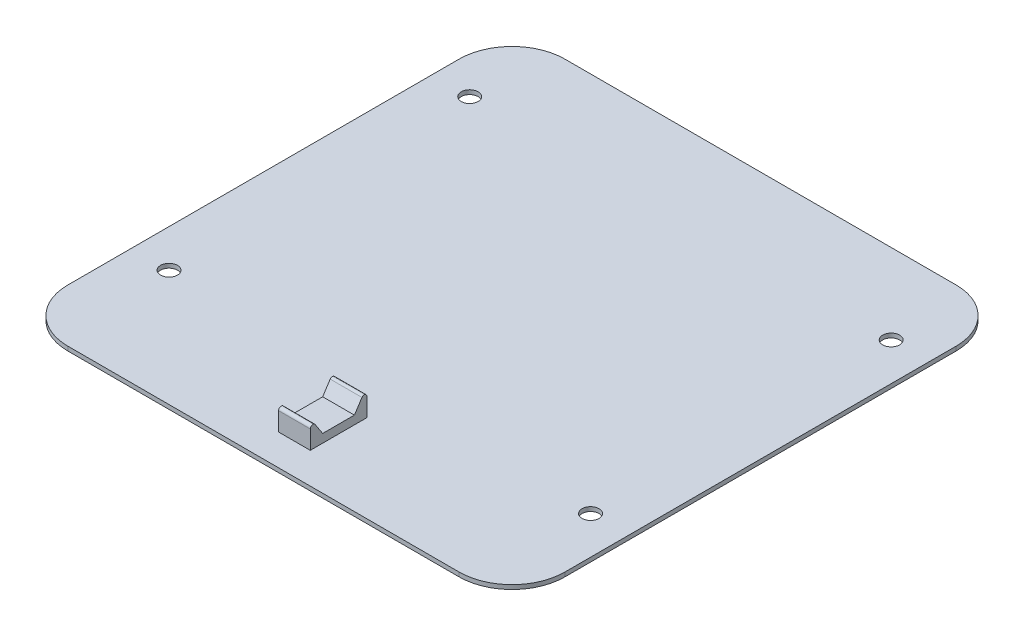
ISO-10303-21;
HEADER;
FILE_DESCRIPTION(('STEP AP214'),'2;1');
FILE_NAME('part.step','',(''),(''),'','','');
FILE_SCHEMA(('AUTOMOTIVE_DESIGN { 1 0 10303 214 1 1 1 1 }'));
ENDSEC;
DATA;
#1=APPLICATION_CONTEXT('core data for automotive mechanical design processes');
#2=APPLICATION_PROTOCOL_DEFINITION('international standard','automotive_design',2000,#1);
#3=PRODUCT_CONTEXT('',#1,'mechanical');
#4=PRODUCT('Part','Part','',(#3));
#5=PRODUCT_RELATED_PRODUCT_CATEGORY('part','',(#4));
#6=PRODUCT_DEFINITION_FORMATION('','',#4);
#7=PRODUCT_DEFINITION_CONTEXT('part definition',#1,'design');
#8=PRODUCT_DEFINITION('design','',#6,#7);
#9=PRODUCT_DEFINITION_SHAPE('','',#8);
#10=(LENGTH_UNIT() NAMED_UNIT(*) SI_UNIT(.MILLI.,.METRE.));
#11=(NAMED_UNIT(*) PLANE_ANGLE_UNIT() SI_UNIT($,.RADIAN.));
#12=(NAMED_UNIT(*) SI_UNIT($,.STERADIAN.) SOLID_ANGLE_UNIT());
#13=UNCERTAINTY_MEASURE_WITH_UNIT(LENGTH_MEASURE(1.E-05),#10,'distance_accuracy_value','');
#14=(GEOMETRIC_REPRESENTATION_CONTEXT(3) GLOBAL_UNCERTAINTY_ASSIGNED_CONTEXT((#13)) GLOBAL_UNIT_ASSIGNED_CONTEXT((#10,
#11,#12)) REPRESENTATION_CONTEXT('',''));
#15=CARTESIAN_POINT('',(0.,0.,0.));
#16=DIRECTION('',(0.,0.,1.));
#17=DIRECTION('',(1.,0.,0.));
#18=AXIS2_PLACEMENT_3D('',#15,#16,#17);
#19=CARTESIAN_POINT('',(47.,0.8,-47.));
#20=DIRECTION('',(-1.,0.,0.));
#21=DIRECTION('',(0.,0.,1.));
#22=AXIS2_PLACEMENT_3D('',#19,#20,#21);
#23=PLANE('',#22);
#24=DIRECTION('',(0.,0.,-1.));
#25=VECTOR('',#24,1.);
#26=CARTESIAN_POINT('',(47.,0.,-47.));
#27=LINE('',#26,#25);
#28=CARTESIAN_POINT('',(47.,0.,37.));
#29=VERTEX_POINT('',#28);
#30=CARTESIAN_POINT('',(47.,0.,-37.));
#31=VERTEX_POINT('',#30);
#32=EDGE_CURVE('E223',#29,#31,#27,.T.);
#33=ORIENTED_EDGE('',*,*,#32,.T.);
#34=DIRECTION('',(0.,-1.,0.));
#35=VECTOR('',#34,1.);
#36=CARTESIAN_POINT('',(47.,0.8,-37.));
#37=LINE('',#36,#35);
#38=CARTESIAN_POINT('',(47.,0.8,-37.));
#39=VERTEX_POINT('',#38);
#40=EDGE_CURVE('E263',#31,#39,#37,.F.);
#41=ORIENTED_EDGE('',*,*,#40,.T.);
#42=DIRECTION('',(0.,0.,-1.));
#43=VECTOR('',#42,1.);
#44=CARTESIAN_POINT('',(47.,0.8,-47.));
#45=LINE('',#44,#43);
#46=CARTESIAN_POINT('',(47.,0.8,37.));
#47=VERTEX_POINT('',#46);
#48=EDGE_CURVE('E224',#47,#39,#45,.T.);
#49=ORIENTED_EDGE('',*,*,#48,.F.);
#50=DIRECTION('',(0.,-1.,0.));
#51=VECTOR('',#50,1.);
#52=CARTESIAN_POINT('',(47.,0.8,37.));
#53=LINE('',#52,#51);
#54=EDGE_CURVE('E260',#47,#29,#53,.T.);
#55=ORIENTED_EDGE('',*,*,#54,.T.);
#56=EDGE_LOOP('',(#33,#41,#49,#55));
#57=FACE_BOUND('',#56,.T.);
#58=ADVANCED_FACE('F35',(#57),#23,.F.);
#59=CARTESIAN_POINT('',(-47.,0.8,-47.));
#60=DIRECTION('',(0.,0.,1.));
#61=DIRECTION('',(1.,0.,0.));
#62=AXIS2_PLACEMENT_3D('',#59,#60,#61);
#63=PLANE('',#62);
#64=DIRECTION('',(-1.,0.,0.));
#65=VECTOR('',#64,1.);
#66=CARTESIAN_POINT('',(-47.,0.8,-47.));
#67=LINE('',#66,#65);
#68=CARTESIAN_POINT('',(37.,0.8,-47.));
#69=VERTEX_POINT('',#68);
#70=CARTESIAN_POINT('',(-37.,0.8,-47.));
#71=VERTEX_POINT('',#70);
#72=EDGE_CURVE('E227',#69,#71,#67,.T.);
#73=ORIENTED_EDGE('',*,*,#72,.F.);
#74=DIRECTION('',(0.,-1.,0.));
#75=VECTOR('',#74,1.);
#76=CARTESIAN_POINT('',(37.,0.8,-47.));
#77=LINE('',#76,#75);
#78=CARTESIAN_POINT('',(37.,0.,-47.));
#79=VERTEX_POINT('',#78);
#80=EDGE_CURVE('E249',#69,#79,#77,.T.);
#81=ORIENTED_EDGE('',*,*,#80,.T.);
#82=DIRECTION('',(-1.,0.,0.));
#83=VECTOR('',#82,1.);
#84=CARTESIAN_POINT('',(-47.,0.,-47.));
#85=LINE('',#84,#83);
#86=CARTESIAN_POINT('',(-37.,0.,-47.));
#87=VERTEX_POINT('',#86);
#88=EDGE_CURVE('E240',#79,#87,#85,.T.);
#89=ORIENTED_EDGE('',*,*,#88,.T.);
#90=DIRECTION('',(0.,-1.,0.));
#91=VECTOR('',#90,1.);
#92=CARTESIAN_POINT('',(-37.,0.8,-47.));
#93=LINE('',#92,#91);
#94=EDGE_CURVE('E237',#87,#71,#93,.F.);
#95=ORIENTED_EDGE('',*,*,#94,.T.);
#96=EDGE_LOOP('',(#73,#81,#89,#95));
#97=FACE_BOUND('',#96,.T.);
#98=ADVANCED_FACE('F321',(#97),#63,.F.);
#99=CARTESIAN_POINT('',(-47.,0.8,-47.));
#100=DIRECTION('',(1.,0.,0.));
#101=DIRECTION('',(0.,0.,-1.));
#102=AXIS2_PLACEMENT_3D('',#99,#100,#101);
#103=PLANE('',#102);
#104=DIRECTION('',(0.,0.,1.));
#105=VECTOR('',#104,1.);
#106=CARTESIAN_POINT('',(-47.,0.,-47.));
#107=LINE('',#106,#105);
#108=CARTESIAN_POINT('',(-47.,0.,-37.));
#109=VERTEX_POINT('',#108);
#110=CARTESIAN_POINT('',(-47.,0.,37.));
#111=VERTEX_POINT('',#110);
#112=EDGE_CURVE('E243',#109,#111,#107,.T.);
#113=ORIENTED_EDGE('',*,*,#112,.T.);
#114=DIRECTION('',(0.,-1.,0.));
#115=VECTOR('',#114,1.);
#116=CARTESIAN_POINT('',(-47.,0.8,37.));
#117=LINE('',#116,#115);
#118=CARTESIAN_POINT('',(-47.,0.8,37.));
#119=VERTEX_POINT('',#118);
#120=EDGE_CURVE('E281',#111,#119,#117,.F.);
#121=ORIENTED_EDGE('',*,*,#120,.T.);
#122=DIRECTION('',(0.,0.,1.));
#123=VECTOR('',#122,1.);
#124=CARTESIAN_POINT('',(-47.,0.8,-47.));
#125=LINE('',#124,#123);
#126=CARTESIAN_POINT('',(-47.,0.8,-37.));
#127=VERTEX_POINT('',#126);
#128=EDGE_CURVE('E231',#127,#119,#125,.T.);
#129=ORIENTED_EDGE('',*,*,#128,.F.);
#130=DIRECTION('',(0.,-1.,0.));
#131=VECTOR('',#130,1.);
#132=CARTESIAN_POINT('',(-47.,0.8,-37.));
#133=LINE('',#132,#131);
#134=EDGE_CURVE('E278',#127,#109,#133,.T.);
#135=ORIENTED_EDGE('',*,*,#134,.T.);
#136=EDGE_LOOP('',(#113,#121,#129,#135));
#137=FACE_BOUND('',#136,.T.);
#138=ADVANCED_FACE('F327',(#137),#103,.F.);
#139=CARTESIAN_POINT('',(-47.,0.8,47.));
#140=DIRECTION('',(0.,0.,-1.));
#141=DIRECTION('',(-1.,0.,0.));
#142=AXIS2_PLACEMENT_3D('',#139,#140,#141);
#143=PLANE('',#142);
#144=DIRECTION('',(1.,0.,0.));
#145=VECTOR('',#144,1.);
#146=CARTESIAN_POINT('',(-47.,0.,47.));
#147=LINE('',#146,#145);
#148=CARTESIAN_POINT('',(-37.,0.,47.));
#149=VERTEX_POINT('',#148);
#150=CARTESIAN_POINT('',(37.,0.,47.));
#151=VERTEX_POINT('',#150);
#152=EDGE_CURVE('E228',#149,#151,#147,.T.);
#153=ORIENTED_EDGE('',*,*,#152,.T.);
#154=DIRECTION('',(0.,-1.,0.));
#155=VECTOR('',#154,1.);
#156=CARTESIAN_POINT('',(37.,0.8,47.));
#157=LINE('',#156,#155);
#158=CARTESIAN_POINT('',(37.,0.8,47.));
#159=VERTEX_POINT('',#158);
#160=EDGE_CURVE('E276',#151,#159,#157,.F.);
#161=ORIENTED_EDGE('',*,*,#160,.T.);
#162=DIRECTION('',(1.,0.,0.));
#163=VECTOR('',#162,1.);
#164=CARTESIAN_POINT('',(-47.,0.8,47.));
#165=LINE('',#164,#163);
#166=CARTESIAN_POINT('',(-37.,0.8,47.));
#167=VERTEX_POINT('',#166);
#168=EDGE_CURVE('E234',#167,#159,#165,.T.);
#169=ORIENTED_EDGE('',*,*,#168,.F.);
#170=DIRECTION('',(0.,-1.,0.));
#171=VECTOR('',#170,1.);
#172=CARTESIAN_POINT('',(-37.,0.8,47.));
#173=LINE('',#172,#171);
#174=EDGE_CURVE('E273',#167,#149,#173,.T.);
#175=ORIENTED_EDGE('',*,*,#174,.T.);
#176=EDGE_LOOP('',(#153,#161,#169,#175));
#177=FACE_BOUND('',#176,.T.);
#178=ADVANCED_FACE('F369',(#177),#143,.F.);
#179=CARTESIAN_POINT('',(0.,0.8,0.));
#180=DIRECTION('',(0.,1.,0.));
#181=DIRECTION('',(0.,0.,1.));
#182=AXIS2_PLACEMENT_3D('',#179,#180,#181);
#183=PLANE('',#182);
#184=DIRECTION('',(0.,0.,-1.));
#185=VECTOR('',#184,1.);
#186=CARTESIAN_POINT('',(3.,0.8,41.145));
#187=LINE('',#186,#185);
#188=CARTESIAN_POINT('',(3.,0.8,41.145));
#189=VERTEX_POINT('',#188);
#190=CARTESIAN_POINT('',(3.,0.8,30.455));
#191=VERTEX_POINT('',#190);
#192=EDGE_CURVE('E150',#189,#191,#187,.T.);
#193=ORIENTED_EDGE('',*,*,#192,.F.);
#194=DIRECTION('',(-1.,0.,0.));
#195=VECTOR('',#194,1.);
#196=CARTESIAN_POINT('',(3.,0.8,41.145));
#197=LINE('',#196,#195);
#198=CARTESIAN_POINT('',(-3.,0.8,41.145));
#199=VERTEX_POINT('',#198);
#200=EDGE_CURVE('E158',#189,#199,#197,.T.);
#201=ORIENTED_EDGE('',*,*,#200,.T.);
#202=DIRECTION('',(0.,0.,-1.));
#203=VECTOR('',#202,1.);
#204=CARTESIAN_POINT('',(-3.,0.8,41.145));
#205=LINE('',#204,#203);
#206=CARTESIAN_POINT('',(-3.,0.8,30.455));
#207=VERTEX_POINT('',#206);
#208=EDGE_CURVE('E184',#199,#207,#205,.T.);
#209=ORIENTED_EDGE('',*,*,#208,.T.);
#210=DIRECTION('',(-1.,0.,0.));
#211=VECTOR('',#210,1.);
#212=CARTESIAN_POINT('',(3.,0.8,30.455));
#213=LINE('',#212,#211);
#214=EDGE_CURVE('E166',#191,#207,#213,.T.);
#215=ORIENTED_EDGE('',*,*,#214,.F.);
#216=EDGE_LOOP('',(#193,#201,#209,#215));
#217=FACE_BOUND('',#216,.T.);
#218=CARTESIAN_POINT('',(-39.85,0.8,25.));
#219=DIRECTION('',(0.,1.,0.));
#220=DIRECTION('',(0.,0.,1.));
#221=AXIS2_PLACEMENT_3D('',#218,#219,#220);
#222=CIRCLE('',#221,1.6);
#223=CARTESIAN_POINT('',(-39.85,0.8,26.6));
#224=VERTEX_POINT('',#223);
#225=EDGE_CURVE('E165',#224,#224,#222,.T.);
#226=ORIENTED_EDGE('',*,*,#225,.F.);
#227=EDGE_LOOP('',(#226));
#228=FACE_BOUND('',#227,.T.);
#229=CARTESIAN_POINT('',(39.85,0.8,25.));
#230=DIRECTION('',(0.,1.,0.));
#231=DIRECTION('',(0.,0.,1.));
#232=AXIS2_PLACEMENT_3D('',#229,#230,#231);
#233=CIRCLE('',#232,1.6);
#234=CARTESIAN_POINT('',(39.85,0.8,26.6));
#235=VERTEX_POINT('',#234);
#236=EDGE_CURVE('E208',#235,#235,#233,.T.);
#237=ORIENTED_EDGE('',*,*,#236,.F.);
#238=EDGE_LOOP('',(#237));
#239=FACE_BOUND('',#238,.T.);
#240=CARTESIAN_POINT('',(39.85,0.8,-31.85));
#241=DIRECTION('',(0.,1.,0.));
#242=DIRECTION('',(0.,0.,1.));
#243=AXIS2_PLACEMENT_3D('',#240,#241,#242);
#244=CIRCLE('',#243,1.6);
#245=CARTESIAN_POINT('',(39.85,0.8,-30.25));
#246=VERTEX_POINT('',#245);
#247=EDGE_CURVE('E200',#246,#246,#244,.T.);
#248=ORIENTED_EDGE('',*,*,#247,.F.);
#249=EDGE_LOOP('',(#248));
#250=FACE_BOUND('',#249,.T.);
#251=CARTESIAN_POINT('',(-39.85,0.8,-31.85));
#252=DIRECTION('',(0.,1.,0.));
#253=DIRECTION('',(0.,0.,1.));
#254=AXIS2_PLACEMENT_3D('',#251,#252,#253);
#255=CIRCLE('',#254,1.6);
#256=CARTESIAN_POINT('',(-39.85,0.8,-30.25));
#257=VERTEX_POINT('',#256);
#258=EDGE_CURVE('E207',#257,#257,#255,.T.);
#259=ORIENTED_EDGE('',*,*,#258,.F.);
#260=EDGE_LOOP('',(#259));
#261=FACE_BOUND('',#260,.T.);
#262=ORIENTED_EDGE('',*,*,#48,.T.);
#263=CARTESIAN_POINT('',(37.,0.8,-37.));
#264=DIRECTION('',(0.,1.,0.));
#265=DIRECTION('',(0.,0.,1.));
#266=AXIS2_PLACEMENT_3D('',#263,#264,#265);
#267=CIRCLE('',#266,10.);
#268=EDGE_CURVE('E271',#39,#69,#267,.T.);
#269=ORIENTED_EDGE('',*,*,#268,.T.);
#270=ORIENTED_EDGE('',*,*,#72,.T.);
#271=CARTESIAN_POINT('',(-37.,0.8,-37.));
#272=DIRECTION('',(0.,1.,0.));
#273=DIRECTION('',(0.,0.,1.));
#274=AXIS2_PLACEMENT_3D('',#271,#272,#273);
#275=CIRCLE('',#274,10.);
#276=EDGE_CURVE('E265',#71,#127,#275,.T.);
#277=ORIENTED_EDGE('',*,*,#276,.T.);
#278=ORIENTED_EDGE('',*,*,#128,.T.);
#279=CARTESIAN_POINT('',(-37.,0.8,37.));
#280=DIRECTION('',(0.,1.,0.));
#281=DIRECTION('',(0.,0.,1.));
#282=AXIS2_PLACEMENT_3D('',#279,#280,#281);
#283=CIRCLE('',#282,10.);
#284=EDGE_CURVE('E267',#119,#167,#283,.T.);
#285=ORIENTED_EDGE('',*,*,#284,.T.);
#286=ORIENTED_EDGE('',*,*,#168,.T.);
#287=CARTESIAN_POINT('',(37.,0.8,37.));
#288=DIRECTION('',(0.,1.,0.));
#289=DIRECTION('',(0.,0.,1.));
#290=AXIS2_PLACEMENT_3D('',#287,#288,#289);
#291=CIRCLE('',#290,10.);
#292=EDGE_CURVE('E269',#159,#47,#291,.T.);
#293=ORIENTED_EDGE('',*,*,#292,.T.);
#294=EDGE_LOOP('',(#262,#269,#270,#277,#278,#285,#286,#293));
#295=FACE_BOUND('',#294,.T.);
#296=ADVANCED_FACE('F169',(#217,#228,#239,#250,#261,#295),#183,.T.);
#297=CARTESIAN_POINT('',(0.,0.,0.));
#298=DIRECTION('',(0.,1.,0.));
#299=DIRECTION('',(0.,0.,1.));
#300=AXIS2_PLACEMENT_3D('',#297,#298,#299);
#301=PLANE('',#300);
#302=CARTESIAN_POINT('',(-39.85,0.,25.));
#303=DIRECTION('',(0.,1.,0.));
#304=DIRECTION('',(0.,0.,1.));
#305=AXIS2_PLACEMENT_3D('',#302,#303,#304);
#306=CIRCLE('',#305,1.6);
#307=CARTESIAN_POINT('',(-39.85,0.,26.6));
#308=VERTEX_POINT('',#307);
#309=EDGE_CURVE('E211',#308,#308,#306,.F.);
#310=ORIENTED_EDGE('',*,*,#309,.F.);
#311=EDGE_LOOP('',(#310));
#312=FACE_BOUND('',#311,.T.);
#313=CARTESIAN_POINT('',(39.85,0.,25.));
#314=DIRECTION('',(0.,1.,0.));
#315=DIRECTION('',(0.,0.,1.));
#316=AXIS2_PLACEMENT_3D('',#313,#314,#315);
#317=CIRCLE('',#316,1.6);
#318=CARTESIAN_POINT('',(39.85,0.,26.6));
#319=VERTEX_POINT('',#318);
#320=EDGE_CURVE('E204',#319,#319,#317,.F.);
#321=ORIENTED_EDGE('',*,*,#320,.F.);
#322=EDGE_LOOP('',(#321));
#323=FACE_BOUND('',#322,.T.);
#324=CARTESIAN_POINT('',(39.85,0.,-31.85));
#325=DIRECTION('',(0.,1.,0.));
#326=DIRECTION('',(0.,0.,1.));
#327=AXIS2_PLACEMENT_3D('',#324,#325,#326);
#328=CIRCLE('',#327,1.6);
#329=CARTESIAN_POINT('',(39.85,0.,-30.25));
#330=VERTEX_POINT('',#329);
#331=EDGE_CURVE('E203',#330,#330,#328,.F.);
#332=ORIENTED_EDGE('',*,*,#331,.F.);
#333=EDGE_LOOP('',(#332));
#334=FACE_BOUND('',#333,.T.);
#335=CARTESIAN_POINT('',(-39.85,0.,-31.85));
#336=DIRECTION('',(0.,1.,0.));
#337=DIRECTION('',(0.,0.,1.));
#338=AXIS2_PLACEMENT_3D('',#335,#336,#337);
#339=CIRCLE('',#338,1.6);
#340=CARTESIAN_POINT('',(-39.85,0.,-30.25));
#341=VERTEX_POINT('',#340);
#342=EDGE_CURVE('E220',#341,#341,#339,.F.);
#343=ORIENTED_EDGE('',*,*,#342,.F.);
#344=EDGE_LOOP('',(#343));
#345=FACE_BOUND('',#344,.T.);
#346=ORIENTED_EDGE('',*,*,#88,.F.);
#347=CARTESIAN_POINT('',(37.,0.,-37.));
#348=DIRECTION('',(0.,1.,0.));
#349=DIRECTION('',(0.,0.,1.));
#350=AXIS2_PLACEMENT_3D('',#347,#348,#349);
#351=CIRCLE('',#350,10.);
#352=EDGE_CURVE('E258',#79,#31,#351,.F.);
#353=ORIENTED_EDGE('',*,*,#352,.T.);
#354=ORIENTED_EDGE('',*,*,#32,.F.);
#355=CARTESIAN_POINT('',(37.,0.,37.));
#356=DIRECTION('',(0.,1.,0.));
#357=DIRECTION('',(0.,0.,1.));
#358=AXIS2_PLACEMENT_3D('',#355,#356,#357);
#359=CIRCLE('',#358,10.);
#360=EDGE_CURVE('E256',#29,#151,#359,.F.);
#361=ORIENTED_EDGE('',*,*,#360,.T.);
#362=ORIENTED_EDGE('',*,*,#152,.F.);
#363=CARTESIAN_POINT('',(-37.,0.,37.));
#364=DIRECTION('',(0.,1.,0.));
#365=DIRECTION('',(0.,0.,1.));
#366=AXIS2_PLACEMENT_3D('',#363,#364,#365);
#367=CIRCLE('',#366,10.);
#368=EDGE_CURVE('E254',#149,#111,#367,.F.);
#369=ORIENTED_EDGE('',*,*,#368,.T.);
#370=ORIENTED_EDGE('',*,*,#112,.F.);
#371=CARTESIAN_POINT('',(-37.,0.,-37.));
#372=DIRECTION('',(0.,1.,0.));
#373=DIRECTION('',(0.,0.,1.));
#374=AXIS2_PLACEMENT_3D('',#371,#372,#373);
#375=CIRCLE('',#374,10.);
#376=EDGE_CURVE('E252',#109,#87,#375,.F.);
#377=ORIENTED_EDGE('',*,*,#376,.T.);
#378=EDGE_LOOP('',(#346,#353,#354,#361,#362,#369,#370,#377));
#379=FACE_BOUND('',#378,.T.);
#380=ADVANCED_FACE('F336',(#312,#323,#334,#345,#379),#301,.F.);
#381=CARTESIAN_POINT('',(37.,0.8,-37.));
#382=DIRECTION('',(0.,-1.,0.));
#383=DIRECTION('',(0.,0.,-1.));
#384=AXIS2_PLACEMENT_3D('',#381,#382,#383);
#385=CYLINDRICAL_SURFACE('',#384,10.);
#386=ORIENTED_EDGE('',*,*,#268,.F.);
#387=ORIENTED_EDGE('',*,*,#40,.F.);
#388=ORIENTED_EDGE('',*,*,#352,.F.);
#389=ORIENTED_EDGE('',*,*,#80,.F.);
#390=EDGE_LOOP('',(#386,#387,#388,#389));
#391=FACE_BOUND('',#390,.T.);
#392=ADVANCED_FACE('F332',(#391),#385,.T.);
#393=CARTESIAN_POINT('',(37.,0.8,37.));
#394=DIRECTION('',(0.,-1.,0.));
#395=DIRECTION('',(0.,0.,-1.));
#396=AXIS2_PLACEMENT_3D('',#393,#394,#395);
#397=CYLINDRICAL_SURFACE('',#396,10.);
#398=ORIENTED_EDGE('',*,*,#292,.F.);
#399=ORIENTED_EDGE('',*,*,#160,.F.);
#400=ORIENTED_EDGE('',*,*,#360,.F.);
#401=ORIENTED_EDGE('',*,*,#54,.F.);
#402=EDGE_LOOP('',(#398,#399,#400,#401));
#403=FACE_BOUND('',#402,.T.);
#404=ADVANCED_FACE('F335',(#403),#397,.T.);
#405=CARTESIAN_POINT('',(-37.,0.8,37.));
#406=DIRECTION('',(0.,-1.,0.));
#407=DIRECTION('',(0.,0.,-1.));
#408=AXIS2_PLACEMENT_3D('',#405,#406,#407);
#409=CYLINDRICAL_SURFACE('',#408,10.);
#410=ORIENTED_EDGE('',*,*,#284,.F.);
#411=ORIENTED_EDGE('',*,*,#120,.F.);
#412=ORIENTED_EDGE('',*,*,#368,.F.);
#413=ORIENTED_EDGE('',*,*,#174,.F.);
#414=EDGE_LOOP('',(#410,#411,#412,#413));
#415=FACE_BOUND('',#414,.T.);
#416=ADVANCED_FACE('F340',(#415),#409,.T.);
#417=CARTESIAN_POINT('',(-37.,0.8,-37.));
#418=DIRECTION('',(0.,-1.,0.));
#419=DIRECTION('',(0.,0.,-1.));
#420=AXIS2_PLACEMENT_3D('',#417,#418,#419);
#421=CYLINDRICAL_SURFACE('',#420,10.);
#422=ORIENTED_EDGE('',*,*,#276,.F.);
#423=ORIENTED_EDGE('',*,*,#94,.F.);
#424=ORIENTED_EDGE('',*,*,#376,.F.);
#425=ORIENTED_EDGE('',*,*,#134,.F.);
#426=EDGE_LOOP('',(#422,#423,#424,#425));
#427=FACE_BOUND('',#426,.T.);
#428=ADVANCED_FACE('F344',(#427),#421,.T.);
#429=CARTESIAN_POINT('',(-39.85,-0.00100000000000002,-31.85));
#430=DIRECTION('',(0.,1.,0.));
#431=DIRECTION('',(0.,0.,1.));
#432=AXIS2_PLACEMENT_3D('',#429,#430,#431);
#433=CYLINDRICAL_SURFACE('',#432,1.6);
#434=CARTESIAN_POINT('',(-39.85,0.8,-30.25));
#435=CARTESIAN_POINT('',(-39.85,0.791666666666667,-30.25));
#436=CARTESIAN_POINT('',(-39.85,0.783333333333333,-30.25));
#437=CARTESIAN_POINT('',(-39.85,0.766666666666667,-30.25));
#438=CARTESIAN_POINT('',(-39.85,0.758333333333333,-30.25));
#439=CARTESIAN_POINT('',(-39.85,0.741666666666667,-30.25));
#440=CARTESIAN_POINT('',(-39.85,0.733333333333333,-30.25));
#441=CARTESIAN_POINT('',(-39.85,0.716666666666667,-30.25));
#442=CARTESIAN_POINT('',(-39.85,0.708333333333333,-30.25));
#443=CARTESIAN_POINT('',(-39.85,0.691666666666667,-30.25));
#444=CARTESIAN_POINT('',(-39.85,0.683333333333333,-30.25));
#445=CARTESIAN_POINT('',(-39.85,0.666666666666667,-30.25));
#446=CARTESIAN_POINT('',(-39.85,0.658333333333333,-30.25));
#447=CARTESIAN_POINT('',(-39.85,0.641666666666667,-30.25));
#448=CARTESIAN_POINT('',(-39.85,0.633333333333333,-30.25));
#449=CARTESIAN_POINT('',(-39.85,0.616666666666667,-30.25));
#450=CARTESIAN_POINT('',(-39.85,0.608333333333333,-30.25));
#451=CARTESIAN_POINT('',(-39.85,0.591666666666667,-30.25));
#452=CARTESIAN_POINT('',(-39.85,0.583333333333333,-30.25));
#453=CARTESIAN_POINT('',(-39.85,0.566666666666667,-30.25));
#454=CARTESIAN_POINT('',(-39.85,0.558333333333333,-30.25));
#455=CARTESIAN_POINT('',(-39.85,0.541666666666667,-30.25));
#456=CARTESIAN_POINT('',(-39.85,0.533333333333333,-30.25));
#457=CARTESIAN_POINT('',(-39.85,0.516666666666667,-30.25));
#458=CARTESIAN_POINT('',(-39.85,0.508333333333333,-30.25));
#459=CARTESIAN_POINT('',(-39.85,0.491666666666667,-30.25));
#460=CARTESIAN_POINT('',(-39.85,0.483333333333333,-30.25));
#461=CARTESIAN_POINT('',(-39.85,0.466666666666667,-30.25));
#462=CARTESIAN_POINT('',(-39.85,0.458333333333333,-30.25));
#463=CARTESIAN_POINT('',(-39.85,0.441666666666667,-30.25));
#464=CARTESIAN_POINT('',(-39.85,0.433333333333333,-30.25));
#465=CARTESIAN_POINT('',(-39.85,0.416666666666667,-30.25));
#466=CARTESIAN_POINT('',(-39.85,0.408333333333333,-30.25));
#467=CARTESIAN_POINT('',(-39.85,0.391666666666667,-30.25));
#468=CARTESIAN_POINT('',(-39.85,0.383333333333333,-30.25));
#469=CARTESIAN_POINT('',(-39.85,0.366666666666667,-30.25));
#470=CARTESIAN_POINT('',(-39.85,0.358333333333333,-30.25));
#471=CARTESIAN_POINT('',(-39.85,0.341666666666667,-30.25));
#472=CARTESIAN_POINT('',(-39.85,0.333333333333333,-30.25));
#473=CARTESIAN_POINT('',(-39.85,0.316666666666667,-30.25));
#474=CARTESIAN_POINT('',(-39.85,0.308333333333333,-30.25));
#475=CARTESIAN_POINT('',(-39.85,0.291666666666667,-30.25));
#476=CARTESIAN_POINT('',(-39.85,0.283333333333333,-30.25));
#477=CARTESIAN_POINT('',(-39.85,0.266666666666667,-30.25));
#478=CARTESIAN_POINT('',(-39.85,0.258333333333333,-30.25));
#479=CARTESIAN_POINT('',(-39.85,0.241666666666667,-30.25));
#480=CARTESIAN_POINT('',(-39.85,0.233333333333333,-30.25));
#481=CARTESIAN_POINT('',(-39.85,0.216666666666667,-30.25));
#482=CARTESIAN_POINT('',(-39.85,0.208333333333333,-30.25));
#483=CARTESIAN_POINT('',(-39.85,0.191666666666667,-30.25));
#484=CARTESIAN_POINT('',(-39.85,0.183333333333333,-30.25));
#485=CARTESIAN_POINT('',(-39.85,0.166666666666667,-30.25));
#486=CARTESIAN_POINT('',(-39.85,0.158333333333333,-30.25));
#487=CARTESIAN_POINT('',(-39.85,0.141666666666667,-30.25));
#488=CARTESIAN_POINT('',(-39.85,0.133333333333333,-30.25));
#489=CARTESIAN_POINT('',(-39.85,0.116666666666667,-30.25));
#490=CARTESIAN_POINT('',(-39.85,0.108333333333333,-30.25));
#491=CARTESIAN_POINT('',(-39.85,0.0916666666666667,-30.25));
#492=CARTESIAN_POINT('',(-39.85,0.0833333333333333,-30.25));
#493=CARTESIAN_POINT('',(-39.85,0.0666666666666666,-30.25));
#494=CARTESIAN_POINT('',(-39.85,0.0583333333333333,-30.25));
#495=CARTESIAN_POINT('',(-39.85,0.0416666666666667,-30.25));
#496=CARTESIAN_POINT('',(-39.85,0.0333333333333333,-30.25));
#497=CARTESIAN_POINT('',(-39.85,0.0166666666666666,-30.25));
#498=CARTESIAN_POINT('',(-39.85,0.00833333333333331,-30.25));
#499=CARTESIAN_POINT('',(-39.85,0.,-30.25));
#500=B_SPLINE_CURVE_WITH_KNOTS('',3,(#434,#435,#436,#437,#438,#439,#440,#441,#442,#443,#444,
#445,#446,#447,#448,#449,#450,#451,#452,#453,#454,#455,#456,#457,#458,#459,#460,#461,#462,#463,
#464,#465,#466,#467,#468,#469,#470,#471,#472,#473,#474,#475,#476,#477,#478,#479,#480,#481,#482,
#483,#484,#485,#486,#487,#488,#489,#490,#491,#492,#493,#494,#495,#496,#497,#498,#499),
.UNSPECIFIED.,.F.,.F.,(4,2,2,2,2,2,2,2,2,2,2,2,2,2,2,2,2,2,2,2,2,2,2,2,2,2,2,2,2,2,2,2,4),(0.,
0.025,0.05,0.075,0.1,0.125,0.15,0.175,0.2,0.225,0.25,0.275,0.3,0.325,0.35,0.375,0.4,0.425,0.45,
0.475,0.5,0.525,0.55,0.575,0.6,0.625,0.65,0.675,0.7,0.725,0.75,0.775,0.8),.UNSPECIFIED.);
#501=EDGE_CURVE('BSEAM347',#257,#341,#500,.T.);
#502=ORIENTED_EDGE('',*,*,#258,.T.);
#503=ORIENTED_EDGE('',*,*,#342,.T.);
#504=ORIENTED_EDGE('',*,*,#501,.T.);
#505=ORIENTED_EDGE('',*,*,#501,.F.);
#506=EDGE_LOOP('',(#502,#504,#503,#505));
#507=FACE_BOUND('',#506,.T.);
#508=ADVANCED_FACE('F347',(#507),#433,.F.);
#509=CARTESIAN_POINT('',(39.85,-0.00100000000000002,-31.85));
#510=DIRECTION('',(0.,1.,0.));
#511=DIRECTION('',(0.,0.,1.));
#512=AXIS2_PLACEMENT_3D('',#509,#510,#511);
#513=CYLINDRICAL_SURFACE('',#512,1.6);
#514=CARTESIAN_POINT('',(39.85,0.8,-30.25));
#515=CARTESIAN_POINT('',(39.85,0.791666666666667,-30.25));
#516=CARTESIAN_POINT('',(39.85,0.783333333333333,-30.25));
#517=CARTESIAN_POINT('',(39.85,0.766666666666667,-30.25));
#518=CARTESIAN_POINT('',(39.85,0.758333333333333,-30.25));
#519=CARTESIAN_POINT('',(39.85,0.741666666666667,-30.25));
#520=CARTESIAN_POINT('',(39.85,0.733333333333333,-30.25));
#521=CARTESIAN_POINT('',(39.85,0.716666666666667,-30.25));
#522=CARTESIAN_POINT('',(39.85,0.708333333333333,-30.25));
#523=CARTESIAN_POINT('',(39.85,0.691666666666667,-30.25));
#524=CARTESIAN_POINT('',(39.85,0.683333333333333,-30.25));
#525=CARTESIAN_POINT('',(39.85,0.666666666666667,-30.25));
#526=CARTESIAN_POINT('',(39.85,0.658333333333333,-30.25));
#527=CARTESIAN_POINT('',(39.85,0.641666666666667,-30.25));
#528=CARTESIAN_POINT('',(39.85,0.633333333333333,-30.25));
#529=CARTESIAN_POINT('',(39.85,0.616666666666667,-30.25));
#530=CARTESIAN_POINT('',(39.85,0.608333333333333,-30.25));
#531=CARTESIAN_POINT('',(39.85,0.591666666666667,-30.25));
#532=CARTESIAN_POINT('',(39.85,0.583333333333333,-30.25));
#533=CARTESIAN_POINT('',(39.85,0.566666666666667,-30.25));
#534=CARTESIAN_POINT('',(39.85,0.558333333333333,-30.25));
#535=CARTESIAN_POINT('',(39.85,0.541666666666667,-30.25));
#536=CARTESIAN_POINT('',(39.85,0.533333333333333,-30.25));
#537=CARTESIAN_POINT('',(39.85,0.516666666666667,-30.25));
#538=CARTESIAN_POINT('',(39.85,0.508333333333333,-30.25));
#539=CARTESIAN_POINT('',(39.85,0.491666666666667,-30.25));
#540=CARTESIAN_POINT('',(39.85,0.483333333333333,-30.25));
#541=CARTESIAN_POINT('',(39.85,0.466666666666667,-30.25));
#542=CARTESIAN_POINT('',(39.85,0.458333333333333,-30.25));
#543=CARTESIAN_POINT('',(39.85,0.441666666666667,-30.25));
#544=CARTESIAN_POINT('',(39.85,0.433333333333333,-30.25));
#545=CARTESIAN_POINT('',(39.85,0.416666666666667,-30.25));
#546=CARTESIAN_POINT('',(39.85,0.408333333333333,-30.25));
#547=CARTESIAN_POINT('',(39.85,0.391666666666667,-30.25));
#548=CARTESIAN_POINT('',(39.85,0.383333333333333,-30.25));
#549=CARTESIAN_POINT('',(39.85,0.366666666666667,-30.25));
#550=CARTESIAN_POINT('',(39.85,0.358333333333333,-30.25));
#551=CARTESIAN_POINT('',(39.85,0.341666666666667,-30.25));
#552=CARTESIAN_POINT('',(39.85,0.333333333333333,-30.25));
#553=CARTESIAN_POINT('',(39.85,0.316666666666667,-30.25));
#554=CARTESIAN_POINT('',(39.85,0.308333333333333,-30.25));
#555=CARTESIAN_POINT('',(39.85,0.291666666666667,-30.25));
#556=CARTESIAN_POINT('',(39.85,0.283333333333333,-30.25));
#557=CARTESIAN_POINT('',(39.85,0.266666666666667,-30.25));
#558=CARTESIAN_POINT('',(39.85,0.258333333333333,-30.25));
#559=CARTESIAN_POINT('',(39.85,0.241666666666667,-30.25));
#560=CARTESIAN_POINT('',(39.85,0.233333333333333,-30.25));
#561=CARTESIAN_POINT('',(39.85,0.216666666666667,-30.25));
#562=CARTESIAN_POINT('',(39.85,0.208333333333333,-30.25));
#563=CARTESIAN_POINT('',(39.85,0.191666666666667,-30.25));
#564=CARTESIAN_POINT('',(39.85,0.183333333333333,-30.25));
#565=CARTESIAN_POINT('',(39.85,0.166666666666667,-30.25));
#566=CARTESIAN_POINT('',(39.85,0.158333333333333,-30.25));
#567=CARTESIAN_POINT('',(39.85,0.141666666666667,-30.25));
#568=CARTESIAN_POINT('',(39.85,0.133333333333333,-30.25));
#569=CARTESIAN_POINT('',(39.85,0.116666666666667,-30.25));
#570=CARTESIAN_POINT('',(39.85,0.108333333333333,-30.25));
#571=CARTESIAN_POINT('',(39.85,0.0916666666666667,-30.25));
#572=CARTESIAN_POINT('',(39.85,0.0833333333333333,-30.25));
#573=CARTESIAN_POINT('',(39.85,0.0666666666666666,-30.25));
#574=CARTESIAN_POINT('',(39.85,0.0583333333333333,-30.25));
#575=CARTESIAN_POINT('',(39.85,0.0416666666666667,-30.25));
#576=CARTESIAN_POINT('',(39.85,0.0333333333333333,-30.25));
#577=CARTESIAN_POINT('',(39.85,0.0166666666666666,-30.25));
#578=CARTESIAN_POINT('',(39.85,0.00833333333333331,-30.25));
#579=CARTESIAN_POINT('',(39.85,0.,-30.25));
#580=B_SPLINE_CURVE_WITH_KNOTS('',3,(#514,#515,#516,#517,#518,#519,#520,#521,#522,#523,#524,
#525,#526,#527,#528,#529,#530,#531,#532,#533,#534,#535,#536,#537,#538,#539,#540,#541,#542,#543,
#544,#545,#546,#547,#548,#549,#550,#551,#552,#553,#554,#555,#556,#557,#558,#559,#560,#561,#562,
#563,#564,#565,#566,#567,#568,#569,#570,#571,#572,#573,#574,#575,#576,#577,#578,#579),
.UNSPECIFIED.,.F.,.F.,(4,2,2,2,2,2,2,2,2,2,2,2,2,2,2,2,2,2,2,2,2,2,2,2,2,2,2,2,2,2,2,2,4),(0.,
0.025,0.05,0.075,0.1,0.125,0.15,0.175,0.2,0.225,0.25,0.275,0.3,0.325,0.35,0.375,0.4,0.425,0.45,
0.475,0.5,0.525,0.55,0.575,0.6,0.625,0.65,0.675,0.7,0.725,0.75,0.775,0.8),.UNSPECIFIED.);
#581=EDGE_CURVE('BSEAM352',#246,#330,#580,.T.);
#582=ORIENTED_EDGE('',*,*,#247,.T.);
#583=ORIENTED_EDGE('',*,*,#331,.T.);
#584=ORIENTED_EDGE('',*,*,#581,.T.);
#585=ORIENTED_EDGE('',*,*,#581,.F.);
#586=EDGE_LOOP('',(#582,#584,#583,#585));
#587=FACE_BOUND('',#586,.T.);
#588=ADVANCED_FACE('F352',(#587),#513,.F.);
#589=CARTESIAN_POINT('',(39.85,-0.00100000000000002,25.));
#590=DIRECTION('',(0.,1.,0.));
#591=DIRECTION('',(0.,0.,1.));
#592=AXIS2_PLACEMENT_3D('',#589,#590,#591);
#593=CYLINDRICAL_SURFACE('',#592,1.6);
#594=CARTESIAN_POINT('',(39.85,0.8,26.6));
#595=CARTESIAN_POINT('',(39.85,0.791666666666667,26.6));
#596=CARTESIAN_POINT('',(39.85,0.783333333333333,26.6));
#597=CARTESIAN_POINT('',(39.85,0.766666666666667,26.6));
#598=CARTESIAN_POINT('',(39.85,0.758333333333333,26.6));
#599=CARTESIAN_POINT('',(39.85,0.741666666666667,26.6));
#600=CARTESIAN_POINT('',(39.85,0.733333333333333,26.6));
#601=CARTESIAN_POINT('',(39.85,0.716666666666667,26.6));
#602=CARTESIAN_POINT('',(39.85,0.708333333333333,26.6));
#603=CARTESIAN_POINT('',(39.85,0.691666666666667,26.6));
#604=CARTESIAN_POINT('',(39.85,0.683333333333333,26.6));
#605=CARTESIAN_POINT('',(39.85,0.666666666666667,26.6));
#606=CARTESIAN_POINT('',(39.85,0.658333333333333,26.6));
#607=CARTESIAN_POINT('',(39.85,0.641666666666667,26.6));
#608=CARTESIAN_POINT('',(39.85,0.633333333333333,26.6));
#609=CARTESIAN_POINT('',(39.85,0.616666666666667,26.6));
#610=CARTESIAN_POINT('',(39.85,0.608333333333333,26.6));
#611=CARTESIAN_POINT('',(39.85,0.591666666666667,26.6));
#612=CARTESIAN_POINT('',(39.85,0.583333333333333,26.6));
#613=CARTESIAN_POINT('',(39.85,0.566666666666667,26.6));
#614=CARTESIAN_POINT('',(39.85,0.558333333333333,26.6));
#615=CARTESIAN_POINT('',(39.85,0.541666666666667,26.6));
#616=CARTESIAN_POINT('',(39.85,0.533333333333333,26.6));
#617=CARTESIAN_POINT('',(39.85,0.516666666666667,26.6));
#618=CARTESIAN_POINT('',(39.85,0.508333333333333,26.6));
#619=CARTESIAN_POINT('',(39.85,0.491666666666667,26.6));
#620=CARTESIAN_POINT('',(39.85,0.483333333333333,26.6));
#621=CARTESIAN_POINT('',(39.85,0.466666666666667,26.6));
#622=CARTESIAN_POINT('',(39.85,0.458333333333333,26.6));
#623=CARTESIAN_POINT('',(39.85,0.441666666666667,26.6));
#624=CARTESIAN_POINT('',(39.85,0.433333333333333,26.6));
#625=CARTESIAN_POINT('',(39.85,0.416666666666667,26.6));
#626=CARTESIAN_POINT('',(39.85,0.408333333333333,26.6));
#627=CARTESIAN_POINT('',(39.85,0.391666666666667,26.6));
#628=CARTESIAN_POINT('',(39.85,0.383333333333333,26.6));
#629=CARTESIAN_POINT('',(39.85,0.366666666666667,26.6));
#630=CARTESIAN_POINT('',(39.85,0.358333333333333,26.6));
#631=CARTESIAN_POINT('',(39.85,0.341666666666667,26.6));
#632=CARTESIAN_POINT('',(39.85,0.333333333333333,26.6));
#633=CARTESIAN_POINT('',(39.85,0.316666666666667,26.6));
#634=CARTESIAN_POINT('',(39.85,0.308333333333333,26.6));
#635=CARTESIAN_POINT('',(39.85,0.291666666666667,26.6));
#636=CARTESIAN_POINT('',(39.85,0.283333333333333,26.6));
#637=CARTESIAN_POINT('',(39.85,0.266666666666667,26.6));
#638=CARTESIAN_POINT('',(39.85,0.258333333333333,26.6));
#639=CARTESIAN_POINT('',(39.85,0.241666666666667,26.6));
#640=CARTESIAN_POINT('',(39.85,0.233333333333333,26.6));
#641=CARTESIAN_POINT('',(39.85,0.216666666666667,26.6));
#642=CARTESIAN_POINT('',(39.85,0.208333333333333,26.6));
#643=CARTESIAN_POINT('',(39.85,0.191666666666667,26.6));
#644=CARTESIAN_POINT('',(39.85,0.183333333333333,26.6));
#645=CARTESIAN_POINT('',(39.85,0.166666666666667,26.6));
#646=CARTESIAN_POINT('',(39.85,0.158333333333333,26.6));
#647=CARTESIAN_POINT('',(39.85,0.141666666666667,26.6));
#648=CARTESIAN_POINT('',(39.85,0.133333333333333,26.6));
#649=CARTESIAN_POINT('',(39.85,0.116666666666667,26.6));
#650=CARTESIAN_POINT('',(39.85,0.108333333333333,26.6));
#651=CARTESIAN_POINT('',(39.85,0.0916666666666667,26.6));
#652=CARTESIAN_POINT('',(39.85,0.0833333333333333,26.6));
#653=CARTESIAN_POINT('',(39.85,0.0666666666666666,26.6));
#654=CARTESIAN_POINT('',(39.85,0.0583333333333333,26.6));
#655=CARTESIAN_POINT('',(39.85,0.0416666666666667,26.6));
#656=CARTESIAN_POINT('',(39.85,0.0333333333333333,26.6));
#657=CARTESIAN_POINT('',(39.85,0.0166666666666666,26.6));
#658=CARTESIAN_POINT('',(39.85,0.00833333333333331,26.6));
#659=CARTESIAN_POINT('',(39.85,0.,26.6));
#660=B_SPLINE_CURVE_WITH_KNOTS('',3,(#594,#595,#596,#597,#598,#599,#600,#601,#602,#603,#604,
#605,#606,#607,#608,#609,#610,#611,#612,#613,#614,#615,#616,#617,#618,#619,#620,#621,#622,#623,
#624,#625,#626,#627,#628,#629,#630,#631,#632,#633,#634,#635,#636,#637,#638,#639,#640,#641,#642,
#643,#644,#645,#646,#647,#648,#649,#650,#651,#652,#653,#654,#655,#656,#657,#658,#659),
.UNSPECIFIED.,.F.,.F.,(4,2,2,2,2,2,2,2,2,2,2,2,2,2,2,2,2,2,2,2,2,2,2,2,2,2,2,2,2,2,2,2,4),(0.,
0.025,0.05,0.075,0.1,0.125,0.15,0.175,0.2,0.225,0.25,0.275,0.3,0.325,0.35,0.375,0.4,0.425,0.45,
0.475,0.5,0.525,0.55,0.575,0.6,0.625,0.65,0.675,0.7,0.725,0.75,0.775,0.8),.UNSPECIFIED.);
#661=EDGE_CURVE('BSEAM485',#235,#319,#660,.T.);
#662=ORIENTED_EDGE('',*,*,#236,.T.);
#663=ORIENTED_EDGE('',*,*,#320,.T.);
#664=ORIENTED_EDGE('',*,*,#661,.T.);
#665=ORIENTED_EDGE('',*,*,#661,.F.);
#666=EDGE_LOOP('',(#662,#664,#663,#665));
#667=FACE_BOUND('',#666,.T.);
#668=ADVANCED_FACE('F485',(#667),#593,.F.);
#669=CARTESIAN_POINT('',(-39.85,-0.00100000000000002,25.));
#670=DIRECTION('',(0.,1.,0.));
#671=DIRECTION('',(0.,0.,1.));
#672=AXIS2_PLACEMENT_3D('',#669,#670,#671);
#673=CYLINDRICAL_SURFACE('',#672,1.6);
#674=CARTESIAN_POINT('',(-39.85,0.8,26.6));
#675=CARTESIAN_POINT('',(-39.85,0.791666666666667,26.6));
#676=CARTESIAN_POINT('',(-39.85,0.783333333333333,26.6));
#677=CARTESIAN_POINT('',(-39.85,0.766666666666667,26.6));
#678=CARTESIAN_POINT('',(-39.85,0.758333333333333,26.6));
#679=CARTESIAN_POINT('',(-39.85,0.741666666666667,26.6));
#680=CARTESIAN_POINT('',(-39.85,0.733333333333333,26.6));
#681=CARTESIAN_POINT('',(-39.85,0.716666666666667,26.6));
#682=CARTESIAN_POINT('',(-39.85,0.708333333333333,26.6));
#683=CARTESIAN_POINT('',(-39.85,0.691666666666667,26.6));
#684=CARTESIAN_POINT('',(-39.85,0.683333333333333,26.6));
#685=CARTESIAN_POINT('',(-39.85,0.666666666666667,26.6));
#686=CARTESIAN_POINT('',(-39.85,0.658333333333333,26.6));
#687=CARTESIAN_POINT('',(-39.85,0.641666666666667,26.6));
#688=CARTESIAN_POINT('',(-39.85,0.633333333333333,26.6));
#689=CARTESIAN_POINT('',(-39.85,0.616666666666667,26.6));
#690=CARTESIAN_POINT('',(-39.85,0.608333333333333,26.6));
#691=CARTESIAN_POINT('',(-39.85,0.591666666666667,26.6));
#692=CARTESIAN_POINT('',(-39.85,0.583333333333333,26.6));
#693=CARTESIAN_POINT('',(-39.85,0.566666666666667,26.6));
#694=CARTESIAN_POINT('',(-39.85,0.558333333333333,26.6));
#695=CARTESIAN_POINT('',(-39.85,0.541666666666667,26.6));
#696=CARTESIAN_POINT('',(-39.85,0.533333333333333,26.6));
#697=CARTESIAN_POINT('',(-39.85,0.516666666666667,26.6));
#698=CARTESIAN_POINT('',(-39.85,0.508333333333333,26.6));
#699=CARTESIAN_POINT('',(-39.85,0.491666666666667,26.6));
#700=CARTESIAN_POINT('',(-39.85,0.483333333333333,26.6));
#701=CARTESIAN_POINT('',(-39.85,0.466666666666667,26.6));
#702=CARTESIAN_POINT('',(-39.85,0.458333333333333,26.6));
#703=CARTESIAN_POINT('',(-39.85,0.441666666666667,26.6));
#704=CARTESIAN_POINT('',(-39.85,0.433333333333333,26.6));
#705=CARTESIAN_POINT('',(-39.85,0.416666666666667,26.6));
#706=CARTESIAN_POINT('',(-39.85,0.408333333333333,26.6));
#707=CARTESIAN_POINT('',(-39.85,0.391666666666667,26.6));
#708=CARTESIAN_POINT('',(-39.85,0.383333333333333,26.6));
#709=CARTESIAN_POINT('',(-39.85,0.366666666666667,26.6));
#710=CARTESIAN_POINT('',(-39.85,0.358333333333333,26.6));
#711=CARTESIAN_POINT('',(-39.85,0.341666666666667,26.6));
#712=CARTESIAN_POINT('',(-39.85,0.333333333333333,26.6));
#713=CARTESIAN_POINT('',(-39.85,0.316666666666667,26.6));
#714=CARTESIAN_POINT('',(-39.85,0.308333333333333,26.6));
#715=CARTESIAN_POINT('',(-39.85,0.291666666666667,26.6));
#716=CARTESIAN_POINT('',(-39.85,0.283333333333333,26.6));
#717=CARTESIAN_POINT('',(-39.85,0.266666666666667,26.6));
#718=CARTESIAN_POINT('',(-39.85,0.258333333333333,26.6));
#719=CARTESIAN_POINT('',(-39.85,0.241666666666667,26.6));
#720=CARTESIAN_POINT('',(-39.85,0.233333333333333,26.6));
#721=CARTESIAN_POINT('',(-39.85,0.216666666666667,26.6));
#722=CARTESIAN_POINT('',(-39.85,0.208333333333333,26.6));
#723=CARTESIAN_POINT('',(-39.85,0.191666666666667,26.6));
#724=CARTESIAN_POINT('',(-39.85,0.183333333333333,26.6));
#725=CARTESIAN_POINT('',(-39.85,0.166666666666667,26.6));
#726=CARTESIAN_POINT('',(-39.85,0.158333333333333,26.6));
#727=CARTESIAN_POINT('',(-39.85,0.141666666666667,26.6));
#728=CARTESIAN_POINT('',(-39.85,0.133333333333333,26.6));
#729=CARTESIAN_POINT('',(-39.85,0.116666666666667,26.6));
#730=CARTESIAN_POINT('',(-39.85,0.108333333333333,26.6));
#731=CARTESIAN_POINT('',(-39.85,0.0916666666666667,26.6));
#732=CARTESIAN_POINT('',(-39.85,0.0833333333333333,26.6));
#733=CARTESIAN_POINT('',(-39.85,0.0666666666666666,26.6));
#734=CARTESIAN_POINT('',(-39.85,0.0583333333333333,26.6));
#735=CARTESIAN_POINT('',(-39.85,0.0416666666666667,26.6));
#736=CARTESIAN_POINT('',(-39.85,0.0333333333333333,26.6));
#737=CARTESIAN_POINT('',(-39.85,0.0166666666666666,26.6));
#738=CARTESIAN_POINT('',(-39.85,0.00833333333333331,26.6));
#739=CARTESIAN_POINT('',(-39.85,0.,26.6));
#740=B_SPLINE_CURVE_WITH_KNOTS('',3,(#674,#675,#676,#677,#678,#679,#680,#681,#682,#683,#684,
#685,#686,#687,#688,#689,#690,#691,#692,#693,#694,#695,#696,#697,#698,#699,#700,#701,#702,#703,
#704,#705,#706,#707,#708,#709,#710,#711,#712,#713,#714,#715,#716,#717,#718,#719,#720,#721,#722,
#723,#724,#725,#726,#727,#728,#729,#730,#731,#732,#733,#734,#735,#736,#737,#738,#739),
.UNSPECIFIED.,.F.,.F.,(4,2,2,2,2,2,2,2,2,2,2,2,2,2,2,2,2,2,2,2,2,2,2,2,2,2,2,2,2,2,2,2,4),(0.,
0.025,0.05,0.075,0.1,0.125,0.15,0.175,0.2,0.225,0.25,0.275,0.3,0.325,0.35,0.375,0.4,0.425,0.45,
0.475,0.5,0.525,0.55,0.575,0.6,0.625,0.65,0.675,0.7,0.725,0.75,0.775,0.8),.UNSPECIFIED.);
#741=EDGE_CURVE('BSEAM412',#224,#308,#740,.T.);
#742=ORIENTED_EDGE('',*,*,#225,.T.);
#743=ORIENTED_EDGE('',*,*,#309,.T.);
#744=ORIENTED_EDGE('',*,*,#741,.T.);
#745=ORIENTED_EDGE('',*,*,#741,.F.);
#746=EDGE_LOOP('',(#742,#744,#743,#745));
#747=FACE_BOUND('',#746,.T.);
#748=ADVANCED_FACE('F412',(#747),#673,.F.);
#749=CARTESIAN_POINT('',(3.,5.98,41.145));
#750=DIRECTION('',(0.,0.,-1.));
#751=DIRECTION('',(-1.,0.,0.));
#752=AXIS2_PLACEMENT_3D('',#749,#750,#751);
#753=PLANE('',#752);
#754=DIRECTION('',(0.,-1.,0.));
#755=VECTOR('',#754,1.);
#756=CARTESIAN_POINT('',(3.,5.98,41.145));
#757=LINE('',#756,#755);
#758=CARTESIAN_POINT('',(3.,4.30416792342024,41.145));
#759=VERTEX_POINT('',#758);
#760=EDGE_CURVE('E145',#759,#189,#757,.T.);
#761=ORIENTED_EDGE('',*,*,#760,.F.);
#762=DIRECTION('',(-1.,0.,0.));
#763=VECTOR('',#762,1.);
#764=CARTESIAN_POINT('',(3.,4.30416792342024,41.145));
#765=LINE('',#764,#763);
#766=CARTESIAN_POINT('',(-3.,4.30416792342024,41.145));
#767=VERTEX_POINT('',#766);
#768=EDGE_CURVE('E43',#759,#767,#765,.T.);
#769=ORIENTED_EDGE('',*,*,#768,.T.);
#770=DIRECTION('',(0.,-1.,0.));
#771=VECTOR('',#770,1.);
#772=CARTESIAN_POINT('',(-3.,5.98,41.145));
#773=LINE('',#772,#771);
#774=EDGE_CURVE('E161',#767,#199,#773,.T.);
#775=ORIENTED_EDGE('',*,*,#774,.T.);
#776=ORIENTED_EDGE('',*,*,#200,.F.);
#777=EDGE_LOOP('',(#761,#769,#775,#776));
#778=FACE_BOUND('',#777,.T.);
#779=ADVANCED_FACE('F159',(#778),#753,.F.);
#780=CARTESIAN_POINT('',(3.,0.8,30.455));
#781=DIRECTION('',(0.,0.,1.));
#782=DIRECTION('',(1.,0.,0.));
#783=AXIS2_PLACEMENT_3D('',#780,#781,#782);
#784=PLANE('',#783);
#785=DIRECTION('',(0.,1.,0.));
#786=VECTOR('',#785,1.);
#787=CARTESIAN_POINT('',(-3.,0.8,30.455));
#788=LINE('',#787,#786);
#789=CARTESIAN_POINT('',(-3.,4.30416792342024,30.455));
#790=VERTEX_POINT('',#789);
#791=EDGE_CURVE('E186',#207,#790,#788,.T.);
#792=ORIENTED_EDGE('',*,*,#791,.T.);
#793=DIRECTION('',(-1.,0.,0.));
#794=VECTOR('',#793,1.);
#795=CARTESIAN_POINT('',(3.,4.30416792342024,30.455));
#796=LINE('',#795,#794);
#797=CARTESIAN_POINT('',(3.,4.30416792342024,30.455));
#798=VERTEX_POINT('',#797);
#799=EDGE_CURVE('E290',#790,#798,#796,.F.);
#800=ORIENTED_EDGE('',*,*,#799,.T.);
#801=DIRECTION('',(0.,1.,0.));
#802=VECTOR('',#801,1.);
#803=CARTESIAN_POINT('',(3.,0.8,30.455));
#804=LINE('',#803,#802);
#805=EDGE_CURVE('E172',#191,#798,#804,.T.);
#806=ORIENTED_EDGE('',*,*,#805,.F.);
#807=ORIENTED_EDGE('',*,*,#214,.T.);
#808=EDGE_LOOP('',(#792,#800,#806,#807));
#809=FACE_BOUND('',#808,.T.);
#810=ADVANCED_FACE('F301',(#809),#784,.F.);
#811=CARTESIAN_POINT('',(3.,5.98,30.455));
#812=DIRECTION('',(0.,-0.547941692307329,-0.836516528128034));
#813=DIRECTION('',(0.,0.836516528128034,-0.547941692307329));
#814=AXIS2_PLACEMENT_3D('',#811,#812,#813);
#815=PLANE('',#814);
#816=DIRECTION('',(0.,-0.836516528128034,0.547941692307329));
#817=VECTOR('',#816,1.);
#818=CARTESIAN_POINT('',(3.,5.98,30.455));
#819=LINE('',#818,#817);
#820=CARTESIAN_POINT('',(3.,4.57813876957391,31.373258264064));
#821=VERTEX_POINT('',#820);
#822=CARTESIAN_POINT('',(3.,2.4,32.8));
#823=VERTEX_POINT('',#822);
#824=EDGE_CURVE('E174',#821,#823,#819,.T.);
#825=ORIENTED_EDGE('',*,*,#824,.F.);
#826=DIRECTION('',(-1.,0.,0.));
#827=VECTOR('',#826,1.);
#828=CARTESIAN_POINT('',(3.,4.57813876957391,31.373258264064));
#829=LINE('',#828,#827);
#830=CARTESIAN_POINT('',(-3.,4.57813876957391,31.373258264064));
#831=VERTEX_POINT('',#830);
#832=EDGE_CURVE('E283',#821,#831,#829,.T.);
#833=ORIENTED_EDGE('',*,*,#832,.T.);
#834=DIRECTION('',(0.,-0.836516528128034,0.547941692307329));
#835=VECTOR('',#834,1.);
#836=CARTESIAN_POINT('',(-3.,5.98,30.455));
#837=LINE('',#836,#835);
#838=CARTESIAN_POINT('',(-3.,2.4,32.8));
#839=VERTEX_POINT('',#838);
#840=EDGE_CURVE('E189',#831,#839,#837,.T.);
#841=ORIENTED_EDGE('',*,*,#840,.T.);
#842=DIRECTION('',(-1.,0.,0.));
#843=VECTOR('',#842,1.);
#844=CARTESIAN_POINT('',(3.,2.4,32.8));
#845=LINE('',#844,#843);
#846=EDGE_CURVE('E196',#823,#839,#845,.T.);
#847=ORIENTED_EDGE('',*,*,#846,.F.);
#848=EDGE_LOOP('',(#825,#833,#841,#847));
#849=FACE_BOUND('',#848,.T.);
#850=ADVANCED_FACE('F308',(#849),#815,.F.);
#851=CARTESIAN_POINT('',(3.,2.4,32.8));
#852=DIRECTION('',(0.,-1.,0.));
#853=DIRECTION('',(0.,0.,-1.));
#854=AXIS2_PLACEMENT_3D('',#851,#852,#853);
#855=PLANE('',#854);
#856=DIRECTION('',(0.,0.,1.));
#857=VECTOR('',#856,1.);
#858=CARTESIAN_POINT('',(-3.,2.4,32.8));
#859=LINE('',#858,#857);
#860=CARTESIAN_POINT('',(-3.,2.4,38.8));
#861=VERTEX_POINT('',#860);
#862=EDGE_CURVE('E191',#839,#861,#859,.T.);
#863=ORIENTED_EDGE('',*,*,#862,.T.);
#864=DIRECTION('',(-1.,0.,0.));
#865=VECTOR('',#864,1.);
#866=CARTESIAN_POINT('',(3.,2.4,38.8));
#867=LINE('',#866,#865);
#868=CARTESIAN_POINT('',(3.,2.4,38.8));
#869=VERTEX_POINT('',#868);
#870=EDGE_CURVE('E182',#869,#861,#867,.T.);
#871=ORIENTED_EDGE('',*,*,#870,.F.);
#872=DIRECTION('',(0.,0.,1.));
#873=VECTOR('',#872,1.);
#874=CARTESIAN_POINT('',(3.,2.4,32.8));
#875=LINE('',#874,#873);
#876=EDGE_CURVE('E178',#823,#869,#875,.T.);
#877=ORIENTED_EDGE('',*,*,#876,.F.);
#878=ORIENTED_EDGE('',*,*,#846,.T.);
#879=EDGE_LOOP('',(#863,#871,#877,#878));
#880=FACE_BOUND('',#879,.T.);
#881=ADVANCED_FACE('F313',(#880),#855,.F.);
#882=CARTESIAN_POINT('',(3.,2.4,38.8));
#883=DIRECTION('',(0.,-0.547941692307329,0.836516528128034));
#884=DIRECTION('',(0.,-0.836516528128034,-0.547941692307329));
#885=AXIS2_PLACEMENT_3D('',#882,#883,#884);
#886=PLANE('',#885);
#887=DIRECTION('',(0.,0.836516528128034,0.547941692307329));
#888=VECTOR('',#887,1.);
#889=CARTESIAN_POINT('',(-3.,2.4,38.8));
#890=LINE('',#889,#888);
#891=CARTESIAN_POINT('',(-3.,4.57813876957391,40.226741735936));
#892=VERTEX_POINT('',#891);
#893=EDGE_CURVE('E155',#861,#892,#890,.T.);
#894=ORIENTED_EDGE('',*,*,#893,.T.);
#895=DIRECTION('',(-1.,0.,0.));
#896=VECTOR('',#895,1.);
#897=CARTESIAN_POINT('',(3.,4.57813876957391,40.226741735936));
#898=LINE('',#897,#896);
#899=CARTESIAN_POINT('',(3.,4.57813876957391,40.226741735936));
#900=VERTEX_POINT('',#899);
#901=EDGE_CURVE('E11',#892,#900,#898,.F.);
#902=ORIENTED_EDGE('',*,*,#901,.T.);
#903=DIRECTION('',(0.,0.836516528128034,0.547941692307329));
#904=VECTOR('',#903,1.);
#905=CARTESIAN_POINT('',(3.,2.4,38.8));
#906=LINE('',#905,#904);
#907=EDGE_CURVE('E180',#869,#900,#906,.T.);
#908=ORIENTED_EDGE('',*,*,#907,.F.);
#909=ORIENTED_EDGE('',*,*,#870,.T.);
#910=EDGE_LOOP('',(#894,#902,#908,#909));
#911=FACE_BOUND('',#910,.T.);
#912=ADVANCED_FACE('F315',(#911),#886,.F.);
#913=CARTESIAN_POINT('',(3.,0.,0.));
#914=DIRECTION('',(1.,0.,0.));
#915=DIRECTION('',(0.,0.,-1.));
#916=AXIS2_PLACEMENT_3D('',#913,#914,#915);
#917=PLANE('',#916);
#918=ORIENTED_EDGE('',*,*,#805,.T.);
#919=CARTESIAN_POINT('',(3.,4.30416792342024,30.955));
#920=DIRECTION('',(1.,0.,0.));
#921=DIRECTION('',(0.,0.,-1.));
#922=AXIS2_PLACEMENT_3D('',#919,#920,#921);
#923=CIRCLE('',#922,0.5);
#924=EDGE_CURVE('E293',#798,#821,#923,.T.);
#925=ORIENTED_EDGE('',*,*,#924,.T.);
#926=ORIENTED_EDGE('',*,*,#824,.T.);
#927=ORIENTED_EDGE('',*,*,#876,.T.);
#928=ORIENTED_EDGE('',*,*,#907,.T.);
#929=CARTESIAN_POINT('',(3.,4.30416792342024,40.645));
#930=DIRECTION('',(1.,0.,0.));
#931=DIRECTION('',(0.,0.,-1.));
#932=AXIS2_PLACEMENT_3D('',#929,#930,#931);
#933=CIRCLE('',#932,0.5);
#934=EDGE_CURVE('E55',#900,#759,#933,.T.);
#935=ORIENTED_EDGE('',*,*,#934,.T.);
#936=ORIENTED_EDGE('',*,*,#760,.T.);
#937=ORIENTED_EDGE('',*,*,#192,.T.);
#938=EDGE_LOOP('',(#918,#925,#926,#927,#928,#935,#936,#937));
#939=FACE_BOUND('',#938,.T.);
#940=ADVANCED_FACE('F148',(#939),#917,.T.);
#941=CARTESIAN_POINT('',(-3.,0.,0.));
#942=DIRECTION('',(1.,0.,0.));
#943=DIRECTION('',(0.,0.,-1.));
#944=AXIS2_PLACEMENT_3D('',#941,#942,#943);
#945=PLANE('',#944);
#946=ORIENTED_EDGE('',*,*,#840,.F.);
#947=CARTESIAN_POINT('',(-3.,4.30416792342024,30.955));
#948=DIRECTION('',(1.,0.,0.));
#949=DIRECTION('',(0.,0.,-1.));
#950=AXIS2_PLACEMENT_3D('',#947,#948,#949);
#951=CIRCLE('',#950,0.5);
#952=EDGE_CURVE('E288',#831,#790,#951,.F.);
#953=ORIENTED_EDGE('',*,*,#952,.T.);
#954=ORIENTED_EDGE('',*,*,#791,.F.);
#955=ORIENTED_EDGE('',*,*,#208,.F.);
#956=ORIENTED_EDGE('',*,*,#774,.F.);
#957=CARTESIAN_POINT('',(-3.,4.30416792342024,40.645));
#958=DIRECTION('',(1.,0.,0.));
#959=DIRECTION('',(0.,0.,-1.));
#960=AXIS2_PLACEMENT_3D('',#957,#958,#959);
#961=CIRCLE('',#960,0.5);
#962=EDGE_CURVE('E286',#767,#892,#961,.F.);
#963=ORIENTED_EDGE('',*,*,#962,.T.);
#964=ORIENTED_EDGE('',*,*,#893,.F.);
#965=ORIENTED_EDGE('',*,*,#862,.F.);
#966=EDGE_LOOP('',(#946,#953,#954,#955,#956,#963,#964,#965));
#967=FACE_BOUND('',#966,.T.);
#968=ADVANCED_FACE('F297',(#967),#945,.F.);
#969=CARTESIAN_POINT('',(3.,4.30416792342024,30.955));
#970=DIRECTION('',(-1.,0.,0.));
#971=DIRECTION('',(0.,0.,1.));
#972=AXIS2_PLACEMENT_3D('',#969,#970,#971);
#973=CYLINDRICAL_SURFACE('',#972,0.5);
#974=ORIENTED_EDGE('',*,*,#924,.F.);
#975=ORIENTED_EDGE('',*,*,#799,.F.);
#976=ORIENTED_EDGE('',*,*,#952,.F.);
#977=ORIENTED_EDGE('',*,*,#832,.F.);
#978=EDGE_LOOP('',(#974,#975,#976,#977));
#979=FACE_BOUND('',#978,.T.);
#980=ADVANCED_FACE('F306',(#979),#973,.T.);
#981=CARTESIAN_POINT('',(3.,4.30416792342024,40.645));
#982=DIRECTION('',(-1.,0.,0.));
#983=DIRECTION('',(0.,0.,1.));
#984=AXIS2_PLACEMENT_3D('',#981,#982,#983);
#985=CYLINDRICAL_SURFACE('',#984,0.5);
#986=ORIENTED_EDGE('',*,*,#934,.F.);
#987=ORIENTED_EDGE('',*,*,#901,.F.);
#988=ORIENTED_EDGE('',*,*,#962,.F.);
#989=ORIENTED_EDGE('',*,*,#768,.F.);
#990=EDGE_LOOP('',(#986,#987,#988,#989));
#991=FACE_BOUND('',#990,.T.);
#992=ADVANCED_FACE('F37',(#991),#985,.T.);
#993=CLOSED_SHELL('',(#58,#98,#138,#178,#296,#380,#392,#404,#416,#428,#508,#588,#668,#748,#779,
#810,#850,#881,#912,#940,#968,#980,#992));
#994=MANIFOLD_SOLID_BREP('B2',#993);
#995=ADVANCED_BREP_SHAPE_REPRESENTATION('',(#18,#994),#14);
#996=SHAPE_DEFINITION_REPRESENTATION(#9,#995);
ENDSEC;
END-ISO-10303-21;
